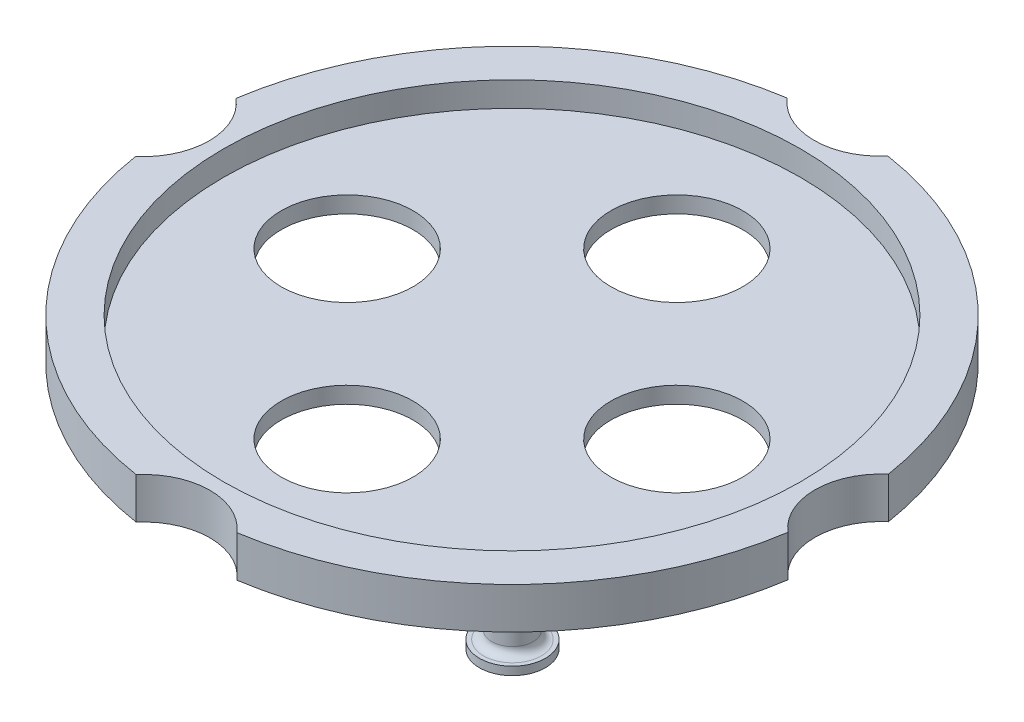
ISO-10303-21;
HEADER;
FILE_DESCRIPTION(('STEP AP214'),'2;1');
FILE_NAME('part.step','',(''),(''),'','','');
FILE_SCHEMA(('AUTOMOTIVE_DESIGN { 1 0 10303 214 1 1 1 1 }'));
ENDSEC;
DATA;
#1=APPLICATION_CONTEXT('core data for automotive mechanical design processes');
#2=APPLICATION_PROTOCOL_DEFINITION('international standard','automotive_design',2000,#1);
#3=PRODUCT_CONTEXT('',#1,'mechanical');
#4=PRODUCT('Part','Part','',(#3));
#5=PRODUCT_RELATED_PRODUCT_CATEGORY('part','',(#4));
#6=PRODUCT_DEFINITION_FORMATION('','',#4);
#7=PRODUCT_DEFINITION_CONTEXT('part definition',#1,'design');
#8=PRODUCT_DEFINITION('design','',#6,#7);
#9=PRODUCT_DEFINITION_SHAPE('','',#8);
#10=(LENGTH_UNIT() NAMED_UNIT(*) SI_UNIT(.MILLI.,.METRE.));
#11=(NAMED_UNIT(*) PLANE_ANGLE_UNIT() SI_UNIT($,.RADIAN.));
#12=(NAMED_UNIT(*) SI_UNIT($,.STERADIAN.) SOLID_ANGLE_UNIT());
#13=UNCERTAINTY_MEASURE_WITH_UNIT(LENGTH_MEASURE(1.E-05),#10,'distance_accuracy_value','');
#14=(GEOMETRIC_REPRESENTATION_CONTEXT(3) GLOBAL_UNCERTAINTY_ASSIGNED_CONTEXT((#13)) GLOBAL_UNIT_ASSIGNED_CONTEXT((#10,
#11,#12)) REPRESENTATION_CONTEXT('',''));
#15=CARTESIAN_POINT('',(0.,0.,0.));
#16=DIRECTION('',(0.,0.,1.));
#17=DIRECTION('',(1.,0.,0.));
#18=AXIS2_PLACEMENT_3D('',#15,#16,#17);
#19=CARTESIAN_POINT('',(0.,6.35,0.));
#20=DIRECTION('',(0.,-1.,0.));
#21=DIRECTION('',(0.,0.,-1.));
#22=AXIS2_PLACEMENT_3D('',#19,#20,#21);
#23=CYLINDRICAL_SURFACE('',#22,50.8);
#24=CARTESIAN_POINT('',(0.,0.,0.));
#25=DIRECTION('',(0.,1.,0.));
#26=DIRECTION('',(0.,0.,1.));
#27=AXIS2_PLACEMENT_3D('',#24,#25,#26);
#28=CIRCLE('',#27,50.8);
#29=CARTESIAN_POINT('',(7.80207250409818,0.,50.1972874231347));
#30=VERTEX_POINT('',#29);
#31=CARTESIAN_POINT('',(50.2141612588498,0.,7.69272442443007));
#32=VERTEX_POINT('',#31);
#33=EDGE_CURVE('E133',#30,#32,#28,.T.);
#34=ORIENTED_EDGE('',*,*,#33,.T.);
#35=DIRECTION('',(0.,1.,0.));
#36=VECTOR('',#35,1.);
#37=CARTESIAN_POINT('',(50.2141612588498,0.,7.69272442443004));
#38=LINE('',#37,#36);
#39=CARTESIAN_POINT('',(50.2141612588498,6.35,7.69272442443004));
#40=VERTEX_POINT('',#39);
#41=EDGE_CURVE('E113',#32,#40,#38,.T.);
#42=ORIENTED_EDGE('',*,*,#41,.T.);
#43=CARTESIAN_POINT('',(0.,6.35,0.));
#44=DIRECTION('',(0.,1.,0.));
#45=DIRECTION('',(0.,0.,1.));
#46=AXIS2_PLACEMENT_3D('',#43,#44,#45);
#47=CIRCLE('',#46,50.8);
#48=CARTESIAN_POINT('',(7.80207250409818,6.35,50.1972874231347));
#49=VERTEX_POINT('',#48);
#50=EDGE_CURVE('E141',#49,#40,#47,.T.);
#51=ORIENTED_EDGE('',*,*,#50,.F.);
#52=DIRECTION('',(0.,1.,0.));
#53=VECTOR('',#52,1.);
#54=CARTESIAN_POINT('',(7.80207250409818,0.,50.1972874231347));
#55=LINE('',#54,#53);
#56=EDGE_CURVE('E262',#30,#49,#55,.T.);
#57=ORIENTED_EDGE('',*,*,#56,.F.);
#58=EDGE_LOOP('',(#34,#42,#51,#57));
#59=FACE_BOUND('',#58,.T.);
#60=ADVANCED_FACE('F43',(#59),#23,.T.);
#61=CARTESIAN_POINT('',(-50.1972874231347,0.,7.80207250409817));
#62=VERTEX_POINT('',#61);
#63=CARTESIAN_POINT('',(-7.69272442443007,0.,50.2141612588498));
#64=VERTEX_POINT('',#63);
#65=EDGE_CURVE('E137',#62,#64,#28,.T.);
#66=ORIENTED_EDGE('',*,*,#65,.T.);
#67=DIRECTION('',(0.,1.,0.));
#68=VECTOR('',#67,1.);
#69=CARTESIAN_POINT('',(-7.69272442443007,0.,50.2141612588498));
#70=LINE('',#69,#68);
#71=CARTESIAN_POINT('',(-7.69272442443007,6.35,50.2141612588498));
#72=VERTEX_POINT('',#71);
#73=EDGE_CURVE('E58',#64,#72,#70,.T.);
#74=ORIENTED_EDGE('',*,*,#73,.T.);
#75=CARTESIAN_POINT('',(-50.1972874231347,6.35,7.80207250409817));
#76=VERTEX_POINT('',#75);
#77=EDGE_CURVE('E136',#76,#72,#47,.T.);
#78=ORIENTED_EDGE('',*,*,#77,.F.);
#79=DIRECTION('',(0.,1.,0.));
#80=VECTOR('',#79,1.);
#81=CARTESIAN_POINT('',(-50.1972874231347,0.,7.80207250409817));
#82=LINE('',#81,#80);
#83=EDGE_CURVE('E257',#62,#76,#82,.T.);
#84=ORIENTED_EDGE('',*,*,#83,.F.);
#85=EDGE_LOOP('',(#66,#74,#78,#84));
#86=FACE_BOUND('',#85,.T.);
#87=ADVANCED_FACE('F299',(#86),#23,.T.);
#88=CARTESIAN_POINT('',(-7.80207250409817,0.,-50.1972874231347));
#89=VERTEX_POINT('',#88);
#90=CARTESIAN_POINT('',(-50.2141612588498,0.,-7.69272442443002));
#91=VERTEX_POINT('',#90);
#92=EDGE_CURVE('E134',#89,#91,#28,.T.);
#93=ORIENTED_EDGE('',*,*,#92,.T.);
#94=DIRECTION('',(0.,1.,0.));
#95=VECTOR('',#94,1.);
#96=CARTESIAN_POINT('',(-50.2141612588498,0.,-7.69272442443002));
#97=LINE('',#96,#95);
#98=CARTESIAN_POINT('',(-50.2141612588498,6.35,-7.69272442443002));
#99=VERTEX_POINT('',#98);
#100=EDGE_CURVE('E66',#91,#99,#97,.T.);
#101=ORIENTED_EDGE('',*,*,#100,.T.);
#102=CARTESIAN_POINT('',(-7.80207250409817,6.35,-50.1972874231347));
#103=VERTEX_POINT('',#102);
#104=EDGE_CURVE('E712',#103,#99,#47,.T.);
#105=ORIENTED_EDGE('',*,*,#104,.F.);
#106=DIRECTION('',(0.,1.,0.));
#107=VECTOR('',#106,1.);
#108=CARTESIAN_POINT('',(-7.80207250409817,0.,-50.1972874231347));
#109=LINE('',#108,#107);
#110=EDGE_CURVE('E249',#89,#103,#109,.T.);
#111=ORIENTED_EDGE('',*,*,#110,.F.);
#112=EDGE_LOOP('',(#93,#101,#105,#111));
#113=FACE_BOUND('',#112,.T.);
#114=ADVANCED_FACE('F295',(#113),#23,.T.);
#115=CARTESIAN_POINT('',(50.1972874231347,6.35,-7.80207250409818));
#116=VERTEX_POINT('',#115);
#117=CARTESIAN_POINT('',(7.69272442443004,6.35,-50.2141612588498));
#118=VERTEX_POINT('',#117);
#119=EDGE_CURVE('E127',#116,#118,#47,.T.);
#120=ORIENTED_EDGE('',*,*,#119,.F.);
#121=DIRECTION('',(0.,1.,0.));
#122=VECTOR('',#121,1.);
#123=CARTESIAN_POINT('',(50.1972874231347,0.,-7.80207250409818));
#124=LINE('',#123,#122);
#125=CARTESIAN_POINT('',(50.1972874231347,0.,-7.80207250409818));
#126=VERTEX_POINT('',#125);
#127=EDGE_CURVE('E110',#126,#116,#124,.T.);
#128=ORIENTED_EDGE('',*,*,#127,.F.);
#129=CARTESIAN_POINT('',(7.69272442443004,0.,-50.2141612588498));
#130=VERTEX_POINT('',#129);
#131=EDGE_CURVE('E125',#126,#130,#28,.T.);
#132=ORIENTED_EDGE('',*,*,#131,.T.);
#133=DIRECTION('',(0.,1.,0.));
#134=VECTOR('',#133,1.);
#135=CARTESIAN_POINT('',(7.69272442443004,0.,-50.2141612588498));
#136=LINE('',#135,#134);
#137=EDGE_CURVE('E264',#130,#118,#136,.T.);
#138=ORIENTED_EDGE('',*,*,#137,.T.);
#139=EDGE_LOOP('',(#120,#128,#132,#138));
#140=FACE_BOUND('',#139,.T.);
#141=ADVANCED_FACE('F123',(#140),#23,.T.);
#142=CARTESIAN_POINT('',(0.,6.35,0.));
#143=DIRECTION('',(0.,1.,0.));
#144=DIRECTION('',(0.,0.,1.));
#145=AXIS2_PLACEMENT_3D('',#142,#143,#144);
#146=PLANE('',#145);
#147=CARTESIAN_POINT('',(56.7786456564067,6.35,-0.0618319519355728));
#148=DIRECTION('',(0.,1.,0.));
#149=DIRECTION('',(0.,0.,1.));
#150=AXIS2_PLACEMENT_3D('',#147,#148,#149);
#151=CIRCLE('',#150,10.16);
#152=EDGE_CURVE('E118',#116,#40,#151,.T.);
#153=ORIENTED_EDGE('',*,*,#152,.F.);
#154=ORIENTED_EDGE('',*,*,#119,.T.);
#155=CARTESIAN_POINT('',(-0.0618319519355833,6.35,-56.7786456564067));
#156=DIRECTION('',(0.,1.,0.));
#157=DIRECTION('',(0.,0.,1.));
#158=AXIS2_PLACEMENT_3D('',#155,#156,#157);
#159=CIRCLE('',#158,10.16);
#160=EDGE_CURVE('E259',#103,#118,#159,.T.);
#161=ORIENTED_EDGE('',*,*,#160,.F.);
#162=ORIENTED_EDGE('',*,*,#104,.T.);
#163=CARTESIAN_POINT('',(-56.7786456564067,6.35,0.0618319519355798));
#164=DIRECTION('',(0.,1.,0.));
#165=DIRECTION('',(0.,0.,1.));
#166=AXIS2_PLACEMENT_3D('',#163,#164,#165);
#167=CIRCLE('',#166,10.16);
#168=EDGE_CURVE('E260',#76,#99,#167,.T.);
#169=ORIENTED_EDGE('',*,*,#168,.F.);
#170=ORIENTED_EDGE('',*,*,#77,.T.);
#171=CARTESIAN_POINT('',(0.0618319519355763,6.35,56.7786456564067));
#172=DIRECTION('',(0.,1.,0.));
#173=DIRECTION('',(0.,0.,1.));
#174=AXIS2_PLACEMENT_3D('',#171,#172,#173);
#175=CIRCLE('',#174,10.16);
#176=EDGE_CURVE('E271',#49,#72,#175,.T.);
#177=ORIENTED_EDGE('',*,*,#176,.F.);
#178=ORIENTED_EDGE('',*,*,#50,.T.);
#179=EDGE_LOOP('',(#153,#154,#161,#162,#169,#170,#177,#178));
#180=FACE_BOUND('',#179,.T.);
#181=CARTESIAN_POINT('',(0.,6.35,0.));
#182=DIRECTION('',(0.,1.,0.));
#183=DIRECTION('',(0.,0.,1.));
#184=AXIS2_PLACEMENT_3D('',#181,#182,#183);
#185=CIRCLE('',#184,44.45);
#186=CARTESIAN_POINT('',(0.,6.35,44.45));
#187=VERTEX_POINT('',#186);
#188=EDGE_CURVE('E155',#187,#187,#185,.T.);
#189=ORIENTED_EDGE('',*,*,#188,.F.);
#190=EDGE_LOOP('',(#189));
#191=FACE_BOUND('',#190,.T.);
#192=ADVANCED_FACE('F284',(#180,#191),#146,.T.);
#193=CARTESIAN_POINT('',(0.,0.,0.));
#194=DIRECTION('',(0.,1.,0.));
#195=DIRECTION('',(0.,0.,1.));
#196=AXIS2_PLACEMENT_3D('',#193,#194,#195);
#197=PLANE('',#196);
#198=CARTESIAN_POINT('',(-30.5661029871241,0.,-30.4996024265976));
#199=DIRECTION('',(0.,1.,0.));
#200=DIRECTION('',(0.,0.,1.));
#201=AXIS2_PLACEMENT_3D('',#198,#199,#200);
#202=CIRCLE('',#201,4.445);
#203=CARTESIAN_POINT('',(-30.5661029871241,0.,-26.0546024265976));
#204=VERTEX_POINT('',#203);
#205=EDGE_CURVE('E11',#204,#204,#202,.T.);
#206=ORIENTED_EDGE('',*,*,#205,.T.);
#207=EDGE_LOOP('',(#206));
#208=FACE_BOUND('',#207,.T.);
#209=CARTESIAN_POINT('',(30.499602426598,0.,-30.5661029871238));
#210=DIRECTION('',(0.,1.,0.));
#211=DIRECTION('',(0.,0.,1.));
#212=AXIS2_PLACEMENT_3D('',#209,#210,#211);
#213=CIRCLE('',#212,4.445);
#214=CARTESIAN_POINT('',(30.499602426598,0.,-26.1211029871238));
#215=VERTEX_POINT('',#214);
#216=EDGE_CURVE('E189',#215,#215,#213,.T.);
#217=ORIENTED_EDGE('',*,*,#216,.T.);
#218=EDGE_LOOP('',(#217));
#219=FACE_BOUND('',#218,.T.);
#220=CARTESIAN_POINT('',(30.5661029871239,0.,30.4996024265978));
#221=DIRECTION('',(0.,1.,0.));
#222=DIRECTION('',(0.,0.,1.));
#223=AXIS2_PLACEMENT_3D('',#220,#221,#222);
#224=CIRCLE('',#223,4.445);
#225=CARTESIAN_POINT('',(30.5661029871239,0.,34.9446024265979));
#226=VERTEX_POINT('',#225);
#227=EDGE_CURVE('E177',#226,#226,#224,.T.);
#228=ORIENTED_EDGE('',*,*,#227,.T.);
#229=EDGE_LOOP('',(#228));
#230=FACE_BOUND('',#229,.T.);
#231=CARTESIAN_POINT('',(-30.499602426598,0.,30.5661029871238));
#232=DIRECTION('',(0.,1.,0.));
#233=DIRECTION('',(0.,0.,1.));
#234=AXIS2_PLACEMENT_3D('',#231,#232,#233);
#235=CIRCLE('',#234,4.445);
#236=CARTESIAN_POINT('',(-30.499602426598,0.,35.0111029871238));
#237=VERTEX_POINT('',#236);
#238=EDGE_CURVE('E165',#237,#237,#235,.T.);
#239=ORIENTED_EDGE('',*,*,#238,.T.);
#240=EDGE_LOOP('',(#239));
#241=FACE_BOUND('',#240,.T.);
#242=CARTESIAN_POINT('',(-2.66050878019847E-13,0.,25.4));
#243=DIRECTION('',(0.,1.,0.));
#244=DIRECTION('',(0.,0.,1.));
#245=AXIS2_PLACEMENT_3D('',#242,#243,#244);
#246=CIRCLE('',#245,10.16);
#247=CARTESIAN_POINT('',(-2.66050878019847E-13,0.,35.56));
#248=VERTEX_POINT('',#247);
#249=EDGE_CURVE('E240',#248,#248,#246,.T.);
#250=ORIENTED_EDGE('',*,*,#249,.T.);
#251=EDGE_LOOP('',(#250));
#252=FACE_BOUND('',#251,.T.);
#253=CARTESIAN_POINT('',(25.4,0.,1.77367252013231E-13));
#254=DIRECTION('',(0.,1.,0.));
#255=DIRECTION('',(0.,0.,1.));
#256=AXIS2_PLACEMENT_3D('',#253,#254,#255);
#257=CIRCLE('',#256,10.16);
#258=CARTESIAN_POINT('',(25.4,0.,10.1600000000002));
#259=VERTEX_POINT('',#258);
#260=EDGE_CURVE('E250',#259,#259,#257,.T.);
#261=ORIENTED_EDGE('',*,*,#260,.T.);
#262=EDGE_LOOP('',(#261));
#263=FACE_BOUND('',#262,.T.);
#264=CARTESIAN_POINT('',(0.,0.,-25.4));
#265=DIRECTION('',(0.,1.,0.));
#266=DIRECTION('',(0.,0.,1.));
#267=AXIS2_PLACEMENT_3D('',#264,#265,#266);
#268=CIRCLE('',#267,10.16);
#269=CARTESIAN_POINT('',(0.,0.,-15.24));
#270=VERTEX_POINT('',#269);
#271=EDGE_CURVE('E246',#270,#270,#268,.T.);
#272=ORIENTED_EDGE('',*,*,#271,.T.);
#273=EDGE_LOOP('',(#272));
#274=FACE_BOUND('',#273,.T.);
#275=CARTESIAN_POINT('',(-25.4,0.,0.));
#276=DIRECTION('',(0.,1.,0.));
#277=DIRECTION('',(0.,0.,1.));
#278=AXIS2_PLACEMENT_3D('',#275,#276,#277);
#279=CIRCLE('',#278,10.16);
#280=CARTESIAN_POINT('',(-25.4,0.,10.16));
#281=VERTEX_POINT('',#280);
#282=EDGE_CURVE('E244',#281,#281,#279,.T.);
#283=ORIENTED_EDGE('',*,*,#282,.T.);
#284=EDGE_LOOP('',(#283));
#285=FACE_BOUND('',#284,.T.);
#286=ORIENTED_EDGE('',*,*,#131,.F.);
#287=CARTESIAN_POINT('',(56.7786456564067,0.,-0.0618319519355728));
#288=DIRECTION('',(0.,1.,0.));
#289=DIRECTION('',(0.,0.,1.));
#290=AXIS2_PLACEMENT_3D('',#287,#288,#289);
#291=CIRCLE('',#290,10.16);
#292=EDGE_CURVE('E107',#126,#32,#291,.T.);
#293=ORIENTED_EDGE('',*,*,#292,.T.);
#294=ORIENTED_EDGE('',*,*,#33,.F.);
#295=CARTESIAN_POINT('',(0.0618319519355763,0.,56.7786456564067));
#296=DIRECTION('',(0.,1.,0.));
#297=DIRECTION('',(0.,0.,1.));
#298=AXIS2_PLACEMENT_3D('',#295,#296,#297);
#299=CIRCLE('',#298,10.16);
#300=EDGE_CURVE('E273',#30,#64,#299,.T.);
#301=ORIENTED_EDGE('',*,*,#300,.T.);
#302=ORIENTED_EDGE('',*,*,#65,.F.);
#303=CARTESIAN_POINT('',(-56.7786456564067,0.,0.0618319519355798));
#304=DIRECTION('',(0.,1.,0.));
#305=DIRECTION('',(0.,0.,1.));
#306=AXIS2_PLACEMENT_3D('',#303,#304,#305);
#307=CIRCLE('',#306,10.16);
#308=EDGE_CURVE('E256',#62,#91,#307,.T.);
#309=ORIENTED_EDGE('',*,*,#308,.T.);
#310=ORIENTED_EDGE('',*,*,#92,.F.);
#311=CARTESIAN_POINT('',(-0.0618319519355833,0.,-56.7786456564067));
#312=DIRECTION('',(0.,1.,0.));
#313=DIRECTION('',(0.,0.,1.));
#314=AXIS2_PLACEMENT_3D('',#311,#312,#313);
#315=CIRCLE('',#314,10.16);
#316=EDGE_CURVE('E132',#89,#130,#315,.T.);
#317=ORIENTED_EDGE('',*,*,#316,.T.);
#318=EDGE_LOOP('',(#286,#293,#294,#301,#302,#309,#310,#317));
#319=FACE_BOUND('',#318,.T.);
#320=ADVANCED_FACE('F130',(#208,#219,#230,#241,#252,#263,#274,#285,#319),#197,.F.);
#321=CARTESIAN_POINT('',(0.,2.54,0.));
#322=DIRECTION('',(0.,1.,0.));
#323=DIRECTION('',(0.,0.,1.));
#324=AXIS2_PLACEMENT_3D('',#321,#322,#323);
#325=CYLINDRICAL_SURFACE('',#324,44.45);
#326=CARTESIAN_POINT('',(0.,2.54,0.));
#327=DIRECTION('',(0.,1.,0.));
#328=DIRECTION('',(0.,0.,1.));
#329=AXIS2_PLACEMENT_3D('',#326,#327,#328);
#330=CIRCLE('',#329,44.45);
#331=CARTESIAN_POINT('',(0.,2.54,44.45));
#332=VERTEX_POINT('',#331);
#333=EDGE_CURVE('E277',#332,#332,#330,.T.);
#334=CARTESIAN_POINT('',(0.,2.54,44.45));
#335=CARTESIAN_POINT('',(0.,2.5796875,44.45));
#336=CARTESIAN_POINT('',(0.,2.619375,44.45));
#337=CARTESIAN_POINT('',(0.,2.69875,44.45));
#338=CARTESIAN_POINT('',(0.,2.7384375,44.45));
#339=CARTESIAN_POINT('',(0.,2.8178125,44.45));
#340=CARTESIAN_POINT('',(0.,2.8575,44.45));
#341=CARTESIAN_POINT('',(0.,2.936875,44.45));
#342=CARTESIAN_POINT('',(0.,2.9765625,44.45));
#343=CARTESIAN_POINT('',(0.,3.0559375,44.45));
#344=CARTESIAN_POINT('',(0.,3.095625,44.45));
#345=CARTESIAN_POINT('',(0.,3.175,44.45));
#346=CARTESIAN_POINT('',(0.,3.2146875,44.45));
#347=CARTESIAN_POINT('',(0.,3.2940625,44.45));
#348=CARTESIAN_POINT('',(0.,3.33375,44.45));
#349=CARTESIAN_POINT('',(0.,3.413125,44.45));
#350=CARTESIAN_POINT('',(0.,3.4528125,44.45));
#351=CARTESIAN_POINT('',(0.,3.5321875,44.45));
#352=CARTESIAN_POINT('',(0.,3.571875,44.45));
#353=CARTESIAN_POINT('',(0.,3.65125,44.45));
#354=CARTESIAN_POINT('',(0.,3.6909375,44.45));
#355=CARTESIAN_POINT('',(0.,3.7703125,44.45));
#356=CARTESIAN_POINT('',(0.,3.81,44.45));
#357=CARTESIAN_POINT('',(0.,3.889375,44.45));
#358=CARTESIAN_POINT('',(0.,3.9290625,44.45));
#359=CARTESIAN_POINT('',(0.,4.0084375,44.45));
#360=CARTESIAN_POINT('',(0.,4.048125,44.45));
#361=CARTESIAN_POINT('',(0.,4.1275,44.45));
#362=CARTESIAN_POINT('',(0.,4.1671875,44.45));
#363=CARTESIAN_POINT('',(0.,4.2465625,44.45));
#364=CARTESIAN_POINT('',(0.,4.28625,44.45));
#365=CARTESIAN_POINT('',(0.,4.365625,44.45));
#366=CARTESIAN_POINT('',(0.,4.4053125,44.45));
#367=CARTESIAN_POINT('',(0.,4.4846875,44.45));
#368=CARTESIAN_POINT('',(0.,4.524375,44.45));
#369=CARTESIAN_POINT('',(0.,4.60375,44.45));
#370=CARTESIAN_POINT('',(0.,4.6434375,44.45));
#371=CARTESIAN_POINT('',(0.,4.7228125,44.45));
#372=CARTESIAN_POINT('',(0.,4.7625,44.45));
#373=CARTESIAN_POINT('',(0.,4.841875,44.45));
#374=CARTESIAN_POINT('',(0.,4.8815625,44.45));
#375=CARTESIAN_POINT('',(0.,4.9609375,44.45));
#376=CARTESIAN_POINT('',(0.,5.000625,44.45));
#377=CARTESIAN_POINT('',(0.,5.08,44.45));
#378=CARTESIAN_POINT('',(0.,5.1196875,44.45));
#379=CARTESIAN_POINT('',(0.,5.1990625,44.45));
#380=CARTESIAN_POINT('',(0.,5.23875,44.45));
#381=CARTESIAN_POINT('',(0.,5.318125,44.45));
#382=CARTESIAN_POINT('',(0.,5.3578125,44.45));
#383=CARTESIAN_POINT('',(0.,5.4371875,44.45));
#384=CARTESIAN_POINT('',(0.,5.476875,44.45));
#385=CARTESIAN_POINT('',(0.,5.55625,44.45));
#386=CARTESIAN_POINT('',(0.,5.5959375,44.45));
#387=CARTESIAN_POINT('',(0.,5.6753125,44.45));
#388=CARTESIAN_POINT('',(0.,5.715,44.45));
#389=CARTESIAN_POINT('',(0.,5.794375,44.45));
#390=CARTESIAN_POINT('',(0.,5.8340625,44.45));
#391=CARTESIAN_POINT('',(0.,5.9134375,44.45));
#392=CARTESIAN_POINT('',(0.,5.953125,44.45));
#393=CARTESIAN_POINT('',(0.,6.0325,44.45));
#394=CARTESIAN_POINT('',(0.,6.0721875,44.45));
#395=CARTESIAN_POINT('',(0.,6.1515625,44.45));
#396=CARTESIAN_POINT('',(0.,6.19125,44.45));
#397=CARTESIAN_POINT('',(0.,6.270625,44.45));
#398=CARTESIAN_POINT('',(0.,6.3103125,44.45));
#399=CARTESIAN_POINT('',(0.,6.35,44.45));
#400=B_SPLINE_CURVE_WITH_KNOTS('',3,(#334,#335,#336,#337,#338,#339,#340,#341,#342,#343,#344,
#345,#346,#347,#348,#349,#350,#351,#352,#353,#354,#355,#356,#357,#358,#359,#360,#361,#362,#363,
#364,#365,#366,#367,#368,#369,#370,#371,#372,#373,#374,#375,#376,#377,#378,#379,#380,#381,#382,
#383,#384,#385,#386,#387,#388,#389,#390,#391,#392,#393,#394,#395,#396,#397,#398,#399),
.UNSPECIFIED.,.F.,.F.,(4,2,2,2,2,2,2,2,2,2,2,2,2,2,2,2,2,2,2,2,2,2,2,2,2,2,2,2,2,2,2,2,4),(0.,
0.1190625,0.238125,0.3571875,0.47625,0.5953125,0.714375,0.8334375,0.9525,1.0715625,1.190625,
1.3096875,1.42875,1.5478125,1.666875,1.7859375,1.905,2.0240625,2.143125,2.2621875,2.38125,
2.5003125,2.619375,2.7384375,2.8575,2.9765625,3.095625,3.2146875,3.33375,3.4528125,3.571875,
3.6909375,3.81),.UNSPECIFIED.);
#401=EDGE_CURVE('BSEAM282',#332,#187,#400,.T.);
#402=ORIENTED_EDGE('',*,*,#333,.F.);
#403=ORIENTED_EDGE('',*,*,#188,.T.);
#404=ORIENTED_EDGE('',*,*,#401,.T.);
#405=ORIENTED_EDGE('',*,*,#401,.F.);
#406=EDGE_LOOP('',(#402,#404,#403,#405));
#407=FACE_BOUND('',#406,.T.);
#408=ADVANCED_FACE('F282',(#407),#325,.F.);
#409=CARTESIAN_POINT('',(0.,2.54,0.));
#410=DIRECTION('',(0.,1.,0.));
#411=DIRECTION('',(0.,0.,1.));
#412=AXIS2_PLACEMENT_3D('',#409,#410,#411);
#413=PLANE('',#412);
#414=CARTESIAN_POINT('',(-2.66050878019847E-13,2.54,25.4));
#415=DIRECTION('',(0.,1.,0.));
#416=DIRECTION('',(0.,0.,1.));
#417=AXIS2_PLACEMENT_3D('',#414,#415,#416);
#418=CIRCLE('',#417,10.16);
#419=CARTESIAN_POINT('',(-2.66050878019847E-13,2.54,35.56));
#420=VERTEX_POINT('',#419);
#421=EDGE_CURVE('E152',#420,#420,#418,.T.);
#422=ORIENTED_EDGE('',*,*,#421,.F.);
#423=EDGE_LOOP('',(#422));
#424=FACE_BOUND('',#423,.T.);
#425=CARTESIAN_POINT('',(25.4,2.54,1.77367252013231E-13));
#426=DIRECTION('',(0.,1.,0.));
#427=DIRECTION('',(0.,0.,1.));
#428=AXIS2_PLACEMENT_3D('',#425,#426,#427);
#429=CIRCLE('',#428,10.16);
#430=CARTESIAN_POINT('',(25.4,2.54,10.1600000000002));
#431=VERTEX_POINT('',#430);
#432=EDGE_CURVE('E149',#431,#431,#429,.T.);
#433=ORIENTED_EDGE('',*,*,#432,.F.);
#434=EDGE_LOOP('',(#433));
#435=FACE_BOUND('',#434,.T.);
#436=CARTESIAN_POINT('',(0.,2.54,-25.4));
#437=DIRECTION('',(0.,1.,0.));
#438=DIRECTION('',(0.,0.,1.));
#439=AXIS2_PLACEMENT_3D('',#436,#437,#438);
#440=CIRCLE('',#439,10.16);
#441=CARTESIAN_POINT('',(0.,2.54,-15.24));
#442=VERTEX_POINT('',#441);
#443=EDGE_CURVE('E146',#442,#442,#440,.T.);
#444=ORIENTED_EDGE('',*,*,#443,.F.);
#445=EDGE_LOOP('',(#444));
#446=FACE_BOUND('',#445,.T.);
#447=CARTESIAN_POINT('',(-25.4,2.54,0.));
#448=DIRECTION('',(0.,1.,0.));
#449=DIRECTION('',(0.,0.,1.));
#450=AXIS2_PLACEMENT_3D('',#447,#448,#449);
#451=CIRCLE('',#450,10.16);
#452=CARTESIAN_POINT('',(-25.4,2.54,10.16));
#453=VERTEX_POINT('',#452);
#454=EDGE_CURVE('E143',#453,#453,#451,.T.);
#455=ORIENTED_EDGE('',*,*,#454,.F.);
#456=EDGE_LOOP('',(#455));
#457=FACE_BOUND('',#456,.T.);
#458=ORIENTED_EDGE('',*,*,#333,.T.);
#459=EDGE_LOOP('',(#458));
#460=FACE_BOUND('',#459,.T.);
#461=ADVANCED_FACE('F390',(#424,#435,#446,#457,#460),#413,.T.);
#462=CARTESIAN_POINT('',(-25.4,0.,0.));
#463=DIRECTION('',(0.,1.,0.));
#464=DIRECTION('',(0.,0.,1.));
#465=AXIS2_PLACEMENT_3D('',#462,#463,#464);
#466=CYLINDRICAL_SURFACE('',#465,10.16);
#467=ORIENTED_EDGE('',*,*,#454,.T.);
#468=EDGE_LOOP('',(#467));
#469=FACE_BOUND('',#468,.T.);
#470=ORIENTED_EDGE('',*,*,#282,.F.);
#471=EDGE_LOOP('',(#470));
#472=FACE_BOUND('',#471,.T.);
#473=ADVANCED_FACE('F372',(#469,#472),#466,.F.);
#474=CARTESIAN_POINT('',(0.,0.,-25.4));
#475=DIRECTION('',(0.,1.,0.));
#476=DIRECTION('',(0.,0.,1.));
#477=AXIS2_PLACEMENT_3D('',#474,#475,#476);
#478=CYLINDRICAL_SURFACE('',#477,10.16);
#479=ORIENTED_EDGE('',*,*,#443,.T.);
#480=EDGE_LOOP('',(#479));
#481=FACE_BOUND('',#480,.T.);
#482=ORIENTED_EDGE('',*,*,#271,.F.);
#483=EDGE_LOOP('',(#482));
#484=FACE_BOUND('',#483,.T.);
#485=ADVANCED_FACE('F368',(#481,#484),#478,.F.);
#486=CARTESIAN_POINT('',(25.4,0.,1.77367252013231E-13));
#487=DIRECTION('',(0.,1.,0.));
#488=DIRECTION('',(0.,0.,1.));
#489=AXIS2_PLACEMENT_3D('',#486,#487,#488);
#490=CYLINDRICAL_SURFACE('',#489,10.16);
#491=ORIENTED_EDGE('',*,*,#432,.T.);
#492=EDGE_LOOP('',(#491));
#493=FACE_BOUND('',#492,.T.);
#494=ORIENTED_EDGE('',*,*,#260,.F.);
#495=EDGE_LOOP('',(#494));
#496=FACE_BOUND('',#495,.T.);
#497=ADVANCED_FACE('F371',(#493,#496),#490,.F.);
#498=CARTESIAN_POINT('',(-2.66050878019847E-13,0.,25.4));
#499=DIRECTION('',(0.,1.,0.));
#500=DIRECTION('',(0.,0.,1.));
#501=AXIS2_PLACEMENT_3D('',#498,#499,#500);
#502=CYLINDRICAL_SURFACE('',#501,10.16);
#503=ORIENTED_EDGE('',*,*,#421,.T.);
#504=EDGE_LOOP('',(#503));
#505=FACE_BOUND('',#504,.T.);
#506=ORIENTED_EDGE('',*,*,#249,.F.);
#507=EDGE_LOOP('',(#506));
#508=FACE_BOUND('',#507,.T.);
#509=ADVANCED_FACE('F376',(#505,#508),#502,.F.);
#510=CARTESIAN_POINT('',(-0.0618319519355833,0.,-56.7786456564067));
#511=DIRECTION('',(0.,1.,0.));
#512=DIRECTION('',(0.,0.,1.));
#513=AXIS2_PLACEMENT_3D('',#510,#511,#512);
#514=CYLINDRICAL_SURFACE('',#513,10.16);
#515=ORIENTED_EDGE('',*,*,#160,.T.);
#516=ORIENTED_EDGE('',*,*,#137,.F.);
#517=ORIENTED_EDGE('',*,*,#316,.F.);
#518=ORIENTED_EDGE('',*,*,#110,.T.);
#519=EDGE_LOOP('',(#515,#516,#517,#518));
#520=FACE_BOUND('',#519,.T.);
#521=ADVANCED_FACE('F380',(#520),#514,.F.);
#522=CARTESIAN_POINT('',(-56.7786456564067,0.,0.0618319519355798));
#523=DIRECTION('',(0.,1.,0.));
#524=DIRECTION('',(0.,0.,1.));
#525=AXIS2_PLACEMENT_3D('',#522,#523,#524);
#526=CYLINDRICAL_SURFACE('',#525,10.16);
#527=ORIENTED_EDGE('',*,*,#168,.T.);
#528=ORIENTED_EDGE('',*,*,#100,.F.);
#529=ORIENTED_EDGE('',*,*,#308,.F.);
#530=ORIENTED_EDGE('',*,*,#83,.T.);
#531=EDGE_LOOP('',(#527,#528,#529,#530));
#532=FACE_BOUND('',#531,.T.);
#533=ADVANCED_FACE('F382',(#532),#526,.F.);
#534=CARTESIAN_POINT('',(0.0618319519355763,0.,56.7786456564067));
#535=DIRECTION('',(0.,1.,0.));
#536=DIRECTION('',(0.,0.,1.));
#537=AXIS2_PLACEMENT_3D('',#534,#535,#536);
#538=CYLINDRICAL_SURFACE('',#537,10.16);
#539=ORIENTED_EDGE('',*,*,#176,.T.);
#540=ORIENTED_EDGE('',*,*,#73,.F.);
#541=ORIENTED_EDGE('',*,*,#300,.F.);
#542=ORIENTED_EDGE('',*,*,#56,.T.);
#543=EDGE_LOOP('',(#539,#540,#541,#542));
#544=FACE_BOUND('',#543,.T.);
#545=ADVANCED_FACE('F367',(#544),#538,.F.);
#546=CARTESIAN_POINT('',(56.7786456564067,0.,-0.0618319519355728));
#547=DIRECTION('',(0.,1.,0.));
#548=DIRECTION('',(0.,0.,1.));
#549=AXIS2_PLACEMENT_3D('',#546,#547,#548);
#550=CYLINDRICAL_SURFACE('',#549,10.16);
#551=ORIENTED_EDGE('',*,*,#152,.T.);
#552=ORIENTED_EDGE('',*,*,#41,.F.);
#553=ORIENTED_EDGE('',*,*,#292,.F.);
#554=ORIENTED_EDGE('',*,*,#127,.T.);
#555=EDGE_LOOP('',(#551,#552,#553,#554));
#556=FACE_BOUND('',#555,.T.);
#557=ADVANCED_FACE('F109',(#556),#550,.F.);
#558=CARTESIAN_POINT('',(-30.499602426598,-6.35,30.5661029871238));
#559=DIRECTION('',(0.,1.,0.));
#560=DIRECTION('',(0.,0.,1.));
#561=AXIS2_PLACEMENT_3D('',#558,#559,#560);
#562=CYLINDRICAL_SURFACE('',#561,3.175);
#563=CARTESIAN_POINT('',(-30.499602426598,-5.08,30.5661029871238));
#564=DIRECTION('',(0.,-1.,0.));
#565=DIRECTION('',(0.,0.,-1.));
#566=AXIS2_PLACEMENT_3D('',#563,#564,#565);
#567=CIRCLE('',#566,3.175);
#568=CARTESIAN_POINT('',(-30.499602426598,-5.08,27.3911029871238));
#569=VERTEX_POINT('',#568);
#570=EDGE_CURVE('E162',#569,#569,#567,.F.);
#571=ORIENTED_EDGE('',*,*,#570,.T.);
#572=EDGE_LOOP('',(#571));
#573=FACE_BOUND('',#572,.T.);
#574=CARTESIAN_POINT('',(-30.499602426598,-1.27,30.5661029871238));
#575=DIRECTION('',(0.,1.,0.));
#576=DIRECTION('',(0.,0.,1.));
#577=AXIS2_PLACEMENT_3D('',#574,#575,#576);
#578=CIRCLE('',#577,3.175);
#579=CARTESIAN_POINT('',(-30.499602426598,-1.27,33.7411029871238));
#580=VERTEX_POINT('',#579);
#581=EDGE_CURVE('E159',#580,#580,#578,.F.);
#582=ORIENTED_EDGE('',*,*,#581,.T.);
#583=EDGE_LOOP('',(#582));
#584=FACE_BOUND('',#583,.T.);
#585=ADVANCED_FACE('F360',(#573,#584),#562,.T.);
#586=CARTESIAN_POINT('',(-30.499602426598,-7.62,30.5661029871238));
#587=DIRECTION('',(0.,1.,0.));
#588=DIRECTION('',(0.,0.,1.));
#589=AXIS2_PLACEMENT_3D('',#586,#587,#588);
#590=CYLINDRICAL_SURFACE('',#589,5.08);
#591=CARTESIAN_POINT('',(-30.499602426598,-7.62,30.5661029871238));
#592=DIRECTION('',(0.,-1.,0.));
#593=DIRECTION('',(0.,0.,-1.));
#594=AXIS2_PLACEMENT_3D('',#591,#592,#593);
#595=CIRCLE('',#594,5.08);
#596=CARTESIAN_POINT('',(-30.499602426598,-7.62,25.4861029871238));
#597=VERTEX_POINT('',#596);
#598=EDGE_CURVE('E237',#597,#597,#595,.T.);
#599=ORIENTED_EDGE('',*,*,#598,.F.);
#600=EDGE_LOOP('',(#599));
#601=FACE_BOUND('',#600,.T.);
#602=CARTESIAN_POINT('',(-30.499602426598,-6.35,30.5661029871238));
#603=DIRECTION('',(0.,-1.,0.));
#604=DIRECTION('',(0.,0.,-1.));
#605=AXIS2_PLACEMENT_3D('',#602,#603,#604);
#606=CIRCLE('',#605,5.08);
#607=CARTESIAN_POINT('',(-30.499602426598,-6.35,25.4861029871238));
#608=VERTEX_POINT('',#607);
#609=EDGE_CURVE('E234',#608,#608,#606,.T.);
#610=ORIENTED_EDGE('',*,*,#609,.T.);
#611=EDGE_LOOP('',(#610));
#612=FACE_BOUND('',#611,.T.);
#613=ADVANCED_FACE('F353',(#601,#612),#590,.T.);
#614=CARTESIAN_POINT('',(-30.499602426598,-7.62,30.5661029871238));
#615=DIRECTION('',(0.,-1.,0.));
#616=DIRECTION('',(0.,0.,-1.));
#617=AXIS2_PLACEMENT_3D('',#614,#615,#616);
#618=PLANE('',#617);
#619=ORIENTED_EDGE('',*,*,#598,.T.);
#620=EDGE_LOOP('',(#619));
#621=FACE_BOUND('',#620,.T.);
#622=ADVANCED_FACE('F350',(#621),#618,.T.);
#623=CARTESIAN_POINT('',(-30.499602426598,-6.35,30.5661029871238));
#624=DIRECTION('',(0.,-1.,0.));
#625=DIRECTION('',(0.,0.,-1.));
#626=AXIS2_PLACEMENT_3D('',#623,#624,#625);
#627=PLANE('',#626);
#628=CARTESIAN_POINT('',(-30.499602426598,-6.35,30.5661029871238));
#629=DIRECTION('',(0.,-1.,0.));
#630=DIRECTION('',(0.,0.,-1.));
#631=AXIS2_PLACEMENT_3D('',#628,#629,#630);
#632=CIRCLE('',#631,4.445);
#633=CARTESIAN_POINT('',(-30.499602426598,-6.35,26.1211029871238));
#634=VERTEX_POINT('',#633);
#635=EDGE_CURVE('E156',#634,#634,#632,.T.);
#636=ORIENTED_EDGE('',*,*,#635,.T.);
#637=EDGE_LOOP('',(#636));
#638=FACE_BOUND('',#637,.T.);
#639=ORIENTED_EDGE('',*,*,#609,.F.);
#640=EDGE_LOOP('',(#639));
#641=FACE_BOUND('',#640,.T.);
#642=ADVANCED_FACE('F311',(#638,#641),#627,.F.);
#643=CARTESIAN_POINT('',(-30.499602426598,-5.08,30.5661029871238));
#644=DIRECTION('',(0.,-1.,0.));
#645=DIRECTION('',(0.,0.,-1.));
#646=AXIS2_PLACEMENT_3D('',#643,#644,#645);
#647=TOROIDAL_SURFACE('',#646,4.445,1.27);
#648=ORIENTED_EDGE('',*,*,#570,.F.);
#649=EDGE_LOOP('',(#648));
#650=FACE_BOUND('',#649,.T.);
#651=ORIENTED_EDGE('',*,*,#635,.F.);
#652=EDGE_LOOP('',(#651));
#653=FACE_BOUND('',#652,.T.);
#654=ADVANCED_FACE('F307',(#650,#653),#647,.F.);
#655=CARTESIAN_POINT('',(-30.499602426598,-1.27,30.5661029871238));
#656=DIRECTION('',(0.,1.,0.));
#657=DIRECTION('',(0.,0.,1.));
#658=AXIS2_PLACEMENT_3D('',#655,#656,#657);
#659=TOROIDAL_SURFACE('',#658,4.445,1.27);
#660=ORIENTED_EDGE('',*,*,#238,.F.);
#661=EDGE_LOOP('',(#660));
#662=FACE_BOUND('',#661,.T.);
#663=ORIENTED_EDGE('',*,*,#581,.F.);
#664=EDGE_LOOP('',(#663));
#665=FACE_BOUND('',#664,.T.);
#666=ADVANCED_FACE('F310',(#662,#665),#659,.F.);
#667=CARTESIAN_POINT('',(30.5661029871239,-6.35,30.4996024265978));
#668=DIRECTION('',(0.,1.,0.));
#669=DIRECTION('',(0.,0.,1.));
#670=AXIS2_PLACEMENT_3D('',#667,#668,#669);
#671=CYLINDRICAL_SURFACE('',#670,3.175);
#672=CARTESIAN_POINT('',(30.5661029871239,-5.08,30.4996024265978));
#673=DIRECTION('',(0.,-1.,0.));
#674=DIRECTION('',(0.,0.,-1.));
#675=AXIS2_PLACEMENT_3D('',#672,#673,#674);
#676=CIRCLE('',#675,3.175);
#677=CARTESIAN_POINT('',(30.5661029871239,-5.08,27.3246024265978));
#678=VERTEX_POINT('',#677);
#679=EDGE_CURVE('E174',#678,#678,#676,.F.);
#680=ORIENTED_EDGE('',*,*,#679,.T.);
#681=EDGE_LOOP('',(#680));
#682=FACE_BOUND('',#681,.T.);
#683=CARTESIAN_POINT('',(30.5661029871239,-1.27,30.4996024265978));
#684=DIRECTION('',(0.,1.,0.));
#685=DIRECTION('',(0.,0.,1.));
#686=AXIS2_PLACEMENT_3D('',#683,#684,#685);
#687=CIRCLE('',#686,3.175);
#688=CARTESIAN_POINT('',(30.5661029871239,-1.27,33.6746024265979));
#689=VERTEX_POINT('',#688);
#690=EDGE_CURVE('E171',#689,#689,#687,.F.);
#691=ORIENTED_EDGE('',*,*,#690,.T.);
#692=EDGE_LOOP('',(#691));
#693=FACE_BOUND('',#692,.T.);
#694=ADVANCED_FACE('F315',(#682,#693),#671,.T.);
#695=CARTESIAN_POINT('',(30.499602426598,-6.35,-30.5661029871238));
#696=DIRECTION('',(0.,1.,0.));
#697=DIRECTION('',(0.,0.,1.));
#698=AXIS2_PLACEMENT_3D('',#695,#696,#697);
#699=CYLINDRICAL_SURFACE('',#698,3.175);
#700=CARTESIAN_POINT('',(30.499602426598,-5.08,-30.5661029871238));
#701=DIRECTION('',(0.,-1.,0.));
#702=DIRECTION('',(0.,0.,-1.));
#703=AXIS2_PLACEMENT_3D('',#700,#701,#702);
#704=CIRCLE('',#703,3.175);
#705=CARTESIAN_POINT('',(30.499602426598,-5.08,-33.7411029871238));
#706=VERTEX_POINT('',#705);
#707=EDGE_CURVE('E186',#706,#706,#704,.F.);
#708=ORIENTED_EDGE('',*,*,#707,.T.);
#709=EDGE_LOOP('',(#708));
#710=FACE_BOUND('',#709,.T.);
#711=CARTESIAN_POINT('',(30.499602426598,-1.27,-30.5661029871238));
#712=DIRECTION('',(0.,1.,0.));
#713=DIRECTION('',(0.,0.,1.));
#714=AXIS2_PLACEMENT_3D('',#711,#712,#713);
#715=CIRCLE('',#714,3.175);
#716=CARTESIAN_POINT('',(30.499602426598,-1.27,-27.3911029871238));
#717=VERTEX_POINT('',#716);
#718=EDGE_CURVE('E183',#717,#717,#715,.F.);
#719=ORIENTED_EDGE('',*,*,#718,.T.);
#720=EDGE_LOOP('',(#719));
#721=FACE_BOUND('',#720,.T.);
#722=ADVANCED_FACE('F336',(#710,#721),#699,.T.);
#723=CARTESIAN_POINT('',(-30.5661029871241,-6.35,-30.4996024265976));
#724=DIRECTION('',(0.,1.,0.));
#725=DIRECTION('',(0.,0.,1.));
#726=AXIS2_PLACEMENT_3D('',#723,#724,#725);
#727=CYLINDRICAL_SURFACE('',#726,3.175);
#728=CARTESIAN_POINT('',(-30.5661029871241,-5.08,-30.4996024265976));
#729=DIRECTION('',(0.,-1.,0.));
#730=DIRECTION('',(0.,0.,-1.));
#731=AXIS2_PLACEMENT_3D('',#728,#729,#730);
#732=CIRCLE('',#731,3.175);
#733=CARTESIAN_POINT('',(-30.5661029871241,-5.08,-33.6746024265976));
#734=VERTEX_POINT('',#733);
#735=EDGE_CURVE('E51',#734,#734,#732,.F.);
#736=ORIENTED_EDGE('',*,*,#735,.T.);
#737=EDGE_LOOP('',(#736));
#738=FACE_BOUND('',#737,.T.);
#739=CARTESIAN_POINT('',(-30.5661029871241,-1.27,-30.4996024265976));
#740=DIRECTION('',(0.,1.,0.));
#741=DIRECTION('',(0.,0.,1.));
#742=AXIS2_PLACEMENT_3D('',#739,#740,#741);
#743=CIRCLE('',#742,3.175);
#744=CARTESIAN_POINT('',(-30.5661029871241,-1.27,-27.3246024265976));
#745=VERTEX_POINT('',#744);
#746=EDGE_CURVE('E195',#745,#745,#743,.F.);
#747=ORIENTED_EDGE('',*,*,#746,.T.);
#748=EDGE_LOOP('',(#747));
#749=FACE_BOUND('',#748,.T.);
#750=ADVANCED_FACE('F200',(#738,#749),#727,.T.);
#751=CARTESIAN_POINT('',(30.5661029871239,-7.62,30.4996024265978));
#752=DIRECTION('',(0.,1.,0.));
#753=DIRECTION('',(0.,0.,1.));
#754=AXIS2_PLACEMENT_3D('',#751,#752,#753);
#755=CYLINDRICAL_SURFACE('',#754,5.08);
#756=CARTESIAN_POINT('',(30.5661029871239,-7.62,30.4996024265978));
#757=DIRECTION('',(0.,-1.,0.));
#758=DIRECTION('',(-1.,0.,0.));
#759=AXIS2_PLACEMENT_3D('',#756,#757,#758);
#760=CIRCLE('',#759,5.08);
#761=CARTESIAN_POINT('',(25.4861029871239,-7.62,30.4996024265979));
#762=VERTEX_POINT('',#761);
#763=EDGE_CURVE('E231',#762,#762,#760,.T.);
#764=ORIENTED_EDGE('',*,*,#763,.F.);
#765=EDGE_LOOP('',(#764));
#766=FACE_BOUND('',#765,.T.);
#767=CARTESIAN_POINT('',(30.5661029871239,-6.35,30.4996024265978));
#768=DIRECTION('',(0.,-1.,0.));
#769=DIRECTION('',(-1.,0.,0.));
#770=AXIS2_PLACEMENT_3D('',#767,#768,#769);
#771=CIRCLE('',#770,5.08);
#772=CARTESIAN_POINT('',(25.4861029871239,-6.35,30.4996024265979));
#773=VERTEX_POINT('',#772);
#774=EDGE_CURVE('E228',#773,#773,#771,.T.);
#775=ORIENTED_EDGE('',*,*,#774,.T.);
#776=EDGE_LOOP('',(#775));
#777=FACE_BOUND('',#776,.T.);
#778=ADVANCED_FACE('F344',(#766,#777),#755,.T.);
#779=CARTESIAN_POINT('',(30.5661029871239,-7.62,30.4996024265978));
#780=DIRECTION('',(0.,-1.,0.));
#781=DIRECTION('',(-1.,0.,0.));
#782=AXIS2_PLACEMENT_3D('',#779,#780,#781);
#783=PLANE('',#782);
#784=ORIENTED_EDGE('',*,*,#763,.T.);
#785=EDGE_LOOP('',(#784));
#786=FACE_BOUND('',#785,.T.);
#787=ADVANCED_FACE('F536',(#786),#783,.T.);
#788=CARTESIAN_POINT('',(30.5661029871239,-6.35,30.4996024265978));
#789=DIRECTION('',(0.,-1.,0.));
#790=DIRECTION('',(-1.,0.,0.));
#791=AXIS2_PLACEMENT_3D('',#788,#789,#790);
#792=PLANE('',#791);
#793=CARTESIAN_POINT('',(30.5661029871239,-6.35,30.4996024265978));
#794=DIRECTION('',(0.,-1.,0.));
#795=DIRECTION('',(0.,0.,-1.));
#796=AXIS2_PLACEMENT_3D('',#793,#794,#795);
#797=CIRCLE('',#796,4.445);
#798=CARTESIAN_POINT('',(30.5661029871239,-6.35,26.0546024265978));
#799=VERTEX_POINT('',#798);
#800=EDGE_CURVE('E168',#799,#799,#797,.T.);
#801=ORIENTED_EDGE('',*,*,#800,.T.);
#802=EDGE_LOOP('',(#801));
#803=FACE_BOUND('',#802,.T.);
#804=ORIENTED_EDGE('',*,*,#774,.F.);
#805=EDGE_LOOP('',(#804));
#806=FACE_BOUND('',#805,.T.);
#807=ADVANCED_FACE('F545',(#803,#806),#792,.F.);
#808=CARTESIAN_POINT('',(30.499602426598,-7.62,-30.5661029871238));
#809=DIRECTION('',(0.,1.,0.));
#810=DIRECTION('',(0.,0.,1.));
#811=AXIS2_PLACEMENT_3D('',#808,#809,#810);
#812=CYLINDRICAL_SURFACE('',#811,5.08);
#813=CARTESIAN_POINT('',(30.499602426598,-7.62,-30.5661029871238));
#814=DIRECTION('',(0.,-1.,0.));
#815=DIRECTION('',(0.,0.,1.));
#816=AXIS2_PLACEMENT_3D('',#813,#814,#815);
#817=CIRCLE('',#816,5.08);
#818=CARTESIAN_POINT('',(30.499602426598,-7.62,-25.4861029871238));
#819=VERTEX_POINT('',#818);
#820=EDGE_CURVE('E225',#819,#819,#817,.T.);
#821=ORIENTED_EDGE('',*,*,#820,.F.);
#822=EDGE_LOOP('',(#821));
#823=FACE_BOUND('',#822,.T.);
#824=CARTESIAN_POINT('',(30.499602426598,-6.35,-30.5661029871238));
#825=DIRECTION('',(0.,-1.,0.));
#826=DIRECTION('',(0.,0.,1.));
#827=AXIS2_PLACEMENT_3D('',#824,#825,#826);
#828=CIRCLE('',#827,5.08);
#829=CARTESIAN_POINT('',(30.499602426598,-6.35,-25.4861029871238));
#830=VERTEX_POINT('',#829);
#831=EDGE_CURVE('E222',#830,#830,#828,.T.);
#832=ORIENTED_EDGE('',*,*,#831,.T.);
#833=EDGE_LOOP('',(#832));
#834=FACE_BOUND('',#833,.T.);
#835=ADVANCED_FACE('F555',(#823,#834),#812,.T.);
#836=CARTESIAN_POINT('',(30.499602426598,-7.62,-30.5661029871238));
#837=DIRECTION('',(0.,-1.,0.));
#838=DIRECTION('',(0.,0.,1.));
#839=AXIS2_PLACEMENT_3D('',#836,#837,#838);
#840=PLANE('',#839);
#841=ORIENTED_EDGE('',*,*,#820,.T.);
#842=EDGE_LOOP('',(#841));
#843=FACE_BOUND('',#842,.T.);
#844=ADVANCED_FACE('F565',(#843),#840,.T.);
#845=CARTESIAN_POINT('',(30.499602426598,-6.35,-30.5661029871238));
#846=DIRECTION('',(0.,-1.,0.));
#847=DIRECTION('',(0.,0.,1.));
#848=AXIS2_PLACEMENT_3D('',#845,#846,#847);
#849=PLANE('',#848);
#850=CARTESIAN_POINT('',(30.499602426598,-6.35,-30.5661029871238));
#851=DIRECTION('',(0.,-1.,0.));
#852=DIRECTION('',(0.,0.,-1.));
#853=AXIS2_PLACEMENT_3D('',#850,#851,#852);
#854=CIRCLE('',#853,4.445);
#855=CARTESIAN_POINT('',(30.499602426598,-6.35,-35.0111029871238));
#856=VERTEX_POINT('',#855);
#857=EDGE_CURVE('E180',#856,#856,#854,.T.);
#858=ORIENTED_EDGE('',*,*,#857,.T.);
#859=EDGE_LOOP('',(#858));
#860=FACE_BOUND('',#859,.T.);
#861=ORIENTED_EDGE('',*,*,#831,.F.);
#862=EDGE_LOOP('',(#861));
#863=FACE_BOUND('',#862,.T.);
#864=ADVANCED_FACE('F575',(#860,#863),#849,.F.);
#865=CARTESIAN_POINT('',(-30.5661029871241,-7.62,-30.4996024265976));
#866=DIRECTION('',(0.,1.,0.));
#867=DIRECTION('',(0.,0.,1.));
#868=AXIS2_PLACEMENT_3D('',#865,#866,#867);
#869=CYLINDRICAL_SURFACE('',#868,5.08);
#870=CARTESIAN_POINT('',(-30.5661029871241,-7.62,-30.4996024265976));
#871=DIRECTION('',(0.,-1.,0.));
#872=DIRECTION('',(1.,0.,0.));
#873=AXIS2_PLACEMENT_3D('',#870,#871,#872);
#874=CIRCLE('',#873,5.08);
#875=CARTESIAN_POINT('',(-25.4861029871241,-7.62,-30.4996024265977));
#876=VERTEX_POINT('',#875);
#877=EDGE_CURVE('E219',#876,#876,#874,.T.);
#878=ORIENTED_EDGE('',*,*,#877,.F.);
#879=EDGE_LOOP('',(#878));
#880=FACE_BOUND('',#879,.T.);
#881=CARTESIAN_POINT('',(-30.5661029871241,-6.35,-30.4996024265976));
#882=DIRECTION('',(0.,-1.,0.));
#883=DIRECTION('',(1.,0.,0.));
#884=AXIS2_PLACEMENT_3D('',#881,#882,#883);
#885=CIRCLE('',#884,5.08);
#886=CARTESIAN_POINT('',(-25.4861029871241,-6.35,-30.4996024265977));
#887=VERTEX_POINT('',#886);
#888=EDGE_CURVE('E217',#887,#887,#885,.T.);
#889=ORIENTED_EDGE('',*,*,#888,.T.);
#890=EDGE_LOOP('',(#889));
#891=FACE_BOUND('',#890,.T.);
#892=ADVANCED_FACE('F585',(#880,#891),#869,.T.);
#893=CARTESIAN_POINT('',(-30.5661029871241,-7.62,-30.4996024265976));
#894=DIRECTION('',(0.,-1.,0.));
#895=DIRECTION('',(1.,0.,0.));
#896=AXIS2_PLACEMENT_3D('',#893,#894,#895);
#897=PLANE('',#896);
#898=ORIENTED_EDGE('',*,*,#877,.T.);
#899=EDGE_LOOP('',(#898));
#900=FACE_BOUND('',#899,.T.);
#901=ADVANCED_FACE('F213',(#900),#897,.T.);
#902=CARTESIAN_POINT('',(-30.5661029871241,-6.35,-30.4996024265976));
#903=DIRECTION('',(0.,-1.,0.));
#904=DIRECTION('',(1.,0.,0.));
#905=AXIS2_PLACEMENT_3D('',#902,#903,#904);
#906=PLANE('',#905);
#907=CARTESIAN_POINT('',(-30.5661029871241,-6.35,-30.4996024265976));
#908=DIRECTION('',(0.,-1.,0.));
#909=DIRECTION('',(0.,0.,-1.));
#910=AXIS2_PLACEMENT_3D('',#907,#908,#909);
#911=CIRCLE('',#910,4.445);
#912=CARTESIAN_POINT('',(-30.5661029871241,-6.35,-34.9446024265976));
#913=VERTEX_POINT('',#912);
#914=EDGE_CURVE('E192',#913,#913,#911,.T.);
#915=ORIENTED_EDGE('',*,*,#914,.T.);
#916=EDGE_LOOP('',(#915));
#917=FACE_BOUND('',#916,.T.);
#918=ORIENTED_EDGE('',*,*,#888,.F.);
#919=EDGE_LOOP('',(#918));
#920=FACE_BOUND('',#919,.T.);
#921=ADVANCED_FACE('F209',(#917,#920),#906,.F.);
#922=CARTESIAN_POINT('',(30.5661029871239,-5.08,30.4996024265978));
#923=DIRECTION('',(0.,-1.,0.));
#924=DIRECTION('',(0.,0.,-1.));
#925=AXIS2_PLACEMENT_3D('',#922,#923,#924);
#926=TOROIDAL_SURFACE('',#925,4.445,1.27);
#927=ORIENTED_EDGE('',*,*,#679,.F.);
#928=EDGE_LOOP('',(#927));
#929=FACE_BOUND('',#928,.T.);
#930=ORIENTED_EDGE('',*,*,#800,.F.);
#931=EDGE_LOOP('',(#930));
#932=FACE_BOUND('',#931,.T.);
#933=ADVANCED_FACE('F212',(#929,#932),#926,.F.);
#934=CARTESIAN_POINT('',(30.5661029871239,-1.27,30.4996024265978));
#935=DIRECTION('',(0.,1.,0.));
#936=DIRECTION('',(0.,0.,1.));
#937=AXIS2_PLACEMENT_3D('',#934,#935,#936);
#938=TOROIDAL_SURFACE('',#937,4.445,1.27);
#939=ORIENTED_EDGE('',*,*,#227,.F.);
#940=EDGE_LOOP('',(#939));
#941=FACE_BOUND('',#940,.T.);
#942=ORIENTED_EDGE('',*,*,#690,.F.);
#943=EDGE_LOOP('',(#942));
#944=FACE_BOUND('',#943,.T.);
#945=ADVANCED_FACE('F319',(#941,#944),#938,.F.);
#946=CARTESIAN_POINT('',(30.499602426598,-5.08,-30.5661029871238));
#947=DIRECTION('',(0.,-1.,0.));
#948=DIRECTION('',(0.,0.,-1.));
#949=AXIS2_PLACEMENT_3D('',#946,#947,#948);
#950=TOROIDAL_SURFACE('',#949,4.445,1.27);
#951=ORIENTED_EDGE('',*,*,#707,.F.);
#952=EDGE_LOOP('',(#951));
#953=FACE_BOUND('',#952,.T.);
#954=ORIENTED_EDGE('',*,*,#857,.F.);
#955=EDGE_LOOP('',(#954));
#956=FACE_BOUND('',#955,.T.);
#957=ADVANCED_FACE('F323',(#953,#956),#950,.F.);
#958=CARTESIAN_POINT('',(30.499602426598,-1.27,-30.5661029871238));
#959=DIRECTION('',(0.,1.,0.));
#960=DIRECTION('',(0.,0.,1.));
#961=AXIS2_PLACEMENT_3D('',#958,#959,#960);
#962=TOROIDAL_SURFACE('',#961,4.445,1.27);
#963=ORIENTED_EDGE('',*,*,#216,.F.);
#964=EDGE_LOOP('',(#963));
#965=FACE_BOUND('',#964,.T.);
#966=ORIENTED_EDGE('',*,*,#718,.F.);
#967=EDGE_LOOP('',(#966));
#968=FACE_BOUND('',#967,.T.);
#969=ADVANCED_FACE('F206',(#965,#968),#962,.F.);
#970=CARTESIAN_POINT('',(-30.5661029871241,-5.08,-30.4996024265976));
#971=DIRECTION('',(0.,-1.,0.));
#972=DIRECTION('',(0.,0.,-1.));
#973=AXIS2_PLACEMENT_3D('',#970,#971,#972);
#974=TOROIDAL_SURFACE('',#973,4.445,1.27);
#975=ORIENTED_EDGE('',*,*,#735,.F.);
#976=EDGE_LOOP('',(#975));
#977=FACE_BOUND('',#976,.T.);
#978=ORIENTED_EDGE('',*,*,#914,.F.);
#979=EDGE_LOOP('',(#978));
#980=FACE_BOUND('',#979,.T.);
#981=ADVANCED_FACE('F203',(#977,#980),#974,.F.);
#982=CARTESIAN_POINT('',(-30.5661029871241,-1.27,-30.4996024265976));
#983=DIRECTION('',(0.,1.,0.));
#984=DIRECTION('',(0.,0.,1.));
#985=AXIS2_PLACEMENT_3D('',#982,#983,#984);
#986=TOROIDAL_SURFACE('',#985,4.445,1.27);
#987=ORIENTED_EDGE('',*,*,#205,.F.);
#988=EDGE_LOOP('',(#987));
#989=FACE_BOUND('',#988,.T.);
#990=ORIENTED_EDGE('',*,*,#746,.F.);
#991=EDGE_LOOP('',(#990));
#992=FACE_BOUND('',#991,.T.);
#993=ADVANCED_FACE('F45',(#989,#992),#986,.F.);
#994=CLOSED_SHELL('',(#60,#87,#114,#141,#192,#320,#408,#461,#473,#485,#497,#509,#521,#533,#545,
#557,#585,#613,#622,#642,#654,#666,#694,#722,#750,#778,#787,#807,#835,#844,#864,#892,#901,#921,
#933,#945,#957,#969,#981,#993));
#995=MANIFOLD_SOLID_BREP('B2',#994);
#996=ADVANCED_BREP_SHAPE_REPRESENTATION('',(#18,#995),#14);
#997=SHAPE_DEFINITION_REPRESENTATION(#9,#996);
ENDSEC;
END-ISO-10303-21;
